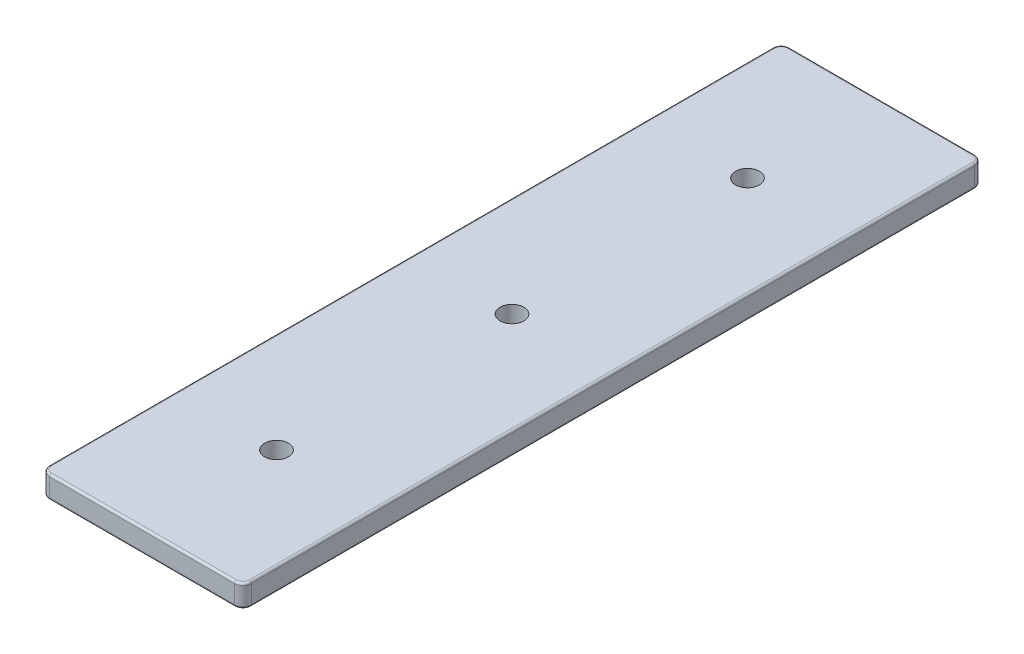
ISO-10303-21;
HEADER;
FILE_DESCRIPTION(('STEP AP214'),'2;1');
FILE_NAME('part.step','',(''),(''),'','','');
FILE_SCHEMA(('AUTOMOTIVE_DESIGN { 1 0 10303 214 1 1 1 1 }'));
ENDSEC;
DATA;
#1=APPLICATION_CONTEXT('core data for automotive mechanical design processes');
#2=APPLICATION_PROTOCOL_DEFINITION('international standard','automotive_design',2000,#1);
#3=PRODUCT_CONTEXT('',#1,'mechanical');
#4=PRODUCT('Part','Part','',(#3));
#5=PRODUCT_RELATED_PRODUCT_CATEGORY('part','',(#4));
#6=PRODUCT_DEFINITION_FORMATION('','',#4);
#7=PRODUCT_DEFINITION_CONTEXT('part definition',#1,'design');
#8=PRODUCT_DEFINITION('design','',#6,#7);
#9=PRODUCT_DEFINITION_SHAPE('','',#8);
#10=(LENGTH_UNIT() NAMED_UNIT(*) SI_UNIT(.MILLI.,.METRE.));
#11=(NAMED_UNIT(*) PLANE_ANGLE_UNIT() SI_UNIT($,.RADIAN.));
#12=(NAMED_UNIT(*) SI_UNIT($,.STERADIAN.) SOLID_ANGLE_UNIT());
#13=UNCERTAINTY_MEASURE_WITH_UNIT(LENGTH_MEASURE(1.E-05),#10,'distance_accuracy_value','');
#14=(GEOMETRIC_REPRESENTATION_CONTEXT(3) GLOBAL_UNCERTAINTY_ASSIGNED_CONTEXT((#13)) GLOBAL_UNIT_ASSIGNED_CONTEXT((#10,
#11,#12)) REPRESENTATION_CONTEXT('',''));
#15=CARTESIAN_POINT('',(0.,0.,0.));
#16=DIRECTION('',(0.,0.,1.));
#17=DIRECTION('',(1.,0.,0.));
#18=AXIS2_PLACEMENT_3D('',#15,#16,#17);
#19=CARTESIAN_POINT('',(19.05,-4.63020833333333,139.7));
#20=DIRECTION('',(-1.,0.,0.));
#21=DIRECTION('',(0.,0.,1.));
#22=AXIS2_PLACEMENT_3D('',#19,#20,#21);
#23=PLANE('',#22);
#24=DIRECTION('',(0.,1.,0.));
#25=VECTOR('',#24,1.);
#26=CARTESIAN_POINT('',(19.05,-4.63020833333333,1.58749999999999));
#27=LINE('',#26,#25);
#28=CARTESIAN_POINT('',(19.05,-4.23333333333333,1.58749999999999));
#29=VERTEX_POINT('',#28);
#30=CARTESIAN_POINT('',(19.05,-0.79375,1.58749999999999));
#31=VERTEX_POINT('',#30);
#32=EDGE_CURVE('E359',#29,#31,#27,.T.);
#33=ORIENTED_EDGE('',*,*,#32,.T.);
#34=DIRECTION('',(0.,0.,1.));
#35=VECTOR('',#34,1.);
#36=CARTESIAN_POINT('',(19.05,-0.79375,139.7));
#37=LINE('',#36,#35);
#38=CARTESIAN_POINT('',(19.05,-0.79375,138.1125));
#39=VERTEX_POINT('',#38);
#40=EDGE_CURVE('E11',#31,#39,#37,.T.);
#41=ORIENTED_EDGE('',*,*,#40,.T.);
#42=DIRECTION('',(0.,1.,0.));
#43=VECTOR('',#42,1.);
#44=CARTESIAN_POINT('',(19.05,-4.63020833333333,138.1125));
#45=LINE('',#44,#43);
#46=CARTESIAN_POINT('',(19.05,-4.23333333333333,138.1125));
#47=VERTEX_POINT('',#46);
#48=EDGE_CURVE('E363',#39,#47,#45,.F.);
#49=ORIENTED_EDGE('',*,*,#48,.T.);
#50=DIRECTION('',(0.,0.,1.));
#51=VECTOR('',#50,1.);
#52=CARTESIAN_POINT('',(19.05,-4.23333333333333,1.58749999999999));
#53=LINE('',#52,#51);
#54=EDGE_CURVE('E51',#47,#29,#53,.F.);
#55=ORIENTED_EDGE('',*,*,#54,.T.);
#56=EDGE_LOOP('',(#33,#41,#49,#55));
#57=FACE_BOUND('',#56,.T.);
#58=ADVANCED_FACE('F41',(#57),#23,.F.);
#59=CARTESIAN_POINT('',(-19.05,-4.63020833333333,139.7));
#60=DIRECTION('',(0.,0.,-1.));
#61=DIRECTION('',(-1.,0.,0.));
#62=AXIS2_PLACEMENT_3D('',#59,#60,#61);
#63=PLANE('',#62);
#64=DIRECTION('',(0.,1.,0.));
#65=VECTOR('',#64,1.);
#66=CARTESIAN_POINT('',(17.4625,-4.63020833333333,139.7));
#67=LINE('',#66,#65);
#68=CARTESIAN_POINT('',(17.4625,-4.23333333333333,139.7));
#69=VERTEX_POINT('',#68);
#70=CARTESIAN_POINT('',(17.4625,-0.79375,139.7));
#71=VERTEX_POINT('',#70);
#72=EDGE_CURVE('E355',#69,#71,#67,.T.);
#73=ORIENTED_EDGE('',*,*,#72,.T.);
#74=DIRECTION('',(-1.,0.,0.));
#75=VECTOR('',#74,1.);
#76=CARTESIAN_POINT('',(-19.05,-0.79375,139.7));
#77=LINE('',#76,#75);
#78=CARTESIAN_POINT('',(-17.4625,-0.79375,139.7));
#79=VERTEX_POINT('',#78);
#80=EDGE_CURVE('E244',#71,#79,#77,.T.);
#81=ORIENTED_EDGE('',*,*,#80,.T.);
#82=DIRECTION('',(0.,1.,0.));
#83=VECTOR('',#82,1.);
#84=CARTESIAN_POINT('',(-17.4625,-4.63020833333333,139.7));
#85=LINE('',#84,#83);
#86=CARTESIAN_POINT('',(-17.4625,-4.23333333333333,139.7));
#87=VERTEX_POINT('',#86);
#88=EDGE_CURVE('E299',#79,#87,#85,.F.);
#89=ORIENTED_EDGE('',*,*,#88,.T.);
#90=DIRECTION('',(-1.,0.,0.));
#91=VECTOR('',#90,1.);
#92=CARTESIAN_POINT('',(17.4625,-4.23333333333333,139.7));
#93=LINE('',#92,#91);
#94=EDGE_CURVE('E241',#87,#69,#93,.F.);
#95=ORIENTED_EDGE('',*,*,#94,.T.);
#96=EDGE_LOOP('',(#73,#81,#89,#95));
#97=FACE_BOUND('',#96,.T.);
#98=ADVANCED_FACE('F414',(#97),#63,.F.);
#99=CARTESIAN_POINT('',(-19.05,-4.63020833333333,139.7));
#100=DIRECTION('',(1.,0.,0.));
#101=DIRECTION('',(0.,0.,-1.));
#102=AXIS2_PLACEMENT_3D('',#99,#100,#101);
#103=PLANE('',#102);
#104=DIRECTION('',(0.,1.,0.));
#105=VECTOR('',#104,1.);
#106=CARTESIAN_POINT('',(-19.05,-4.63020833333333,138.1125));
#107=LINE('',#106,#105);
#108=CARTESIAN_POINT('',(-19.05,-4.23333333333333,138.1125));
#109=VERTEX_POINT('',#108);
#110=CARTESIAN_POINT('',(-19.05,-0.79375,138.1125));
#111=VERTEX_POINT('',#110);
#112=EDGE_CURVE('E371',#109,#111,#107,.T.);
#113=ORIENTED_EDGE('',*,*,#112,.T.);
#114=DIRECTION('',(0.,0.,-1.));
#115=VECTOR('',#114,1.);
#116=CARTESIAN_POINT('',(-19.05,-0.79375,139.7));
#117=LINE('',#116,#115);
#118=CARTESIAN_POINT('',(-19.05,-0.79375,1.58749999999999));
#119=VERTEX_POINT('',#118);
#120=EDGE_CURVE('E232',#111,#119,#117,.T.);
#121=ORIENTED_EDGE('',*,*,#120,.T.);
#122=DIRECTION('',(0.,1.,0.));
#123=VECTOR('',#122,1.);
#124=CARTESIAN_POINT('',(-19.05,-4.63020833333333,1.58749999999999));
#125=LINE('',#124,#123);
#126=CARTESIAN_POINT('',(-19.05,-4.23333333333333,1.58749999999999));
#127=VERTEX_POINT('',#126);
#128=EDGE_CURVE('E367',#119,#127,#125,.F.);
#129=ORIENTED_EDGE('',*,*,#128,.T.);
#130=DIRECTION('',(0.,0.,-1.));
#131=VECTOR('',#130,1.);
#132=CARTESIAN_POINT('',(-19.05,-4.23333333333333,138.1125));
#133=LINE('',#132,#131);
#134=EDGE_CURVE('E229',#127,#109,#133,.F.);
#135=ORIENTED_EDGE('',*,*,#134,.T.);
#136=EDGE_LOOP('',(#113,#121,#129,#135));
#137=FACE_BOUND('',#136,.T.);
#138=ADVANCED_FACE('F461',(#137),#103,.F.);
#139=CARTESIAN_POINT('',(-19.05,-4.63020833333333,0.));
#140=DIRECTION('',(0.,0.,1.));
#141=DIRECTION('',(1.,0.,0.));
#142=AXIS2_PLACEMENT_3D('',#139,#140,#141);
#143=PLANE('',#142);
#144=DIRECTION('',(0.,1.,0.));
#145=VECTOR('',#144,1.);
#146=CARTESIAN_POINT('',(-17.4625,-4.63020833333333,0.));
#147=LINE('',#146,#145);
#148=CARTESIAN_POINT('',(-17.4625,-4.23333333333333,0.));
#149=VERTEX_POINT('',#148);
#150=CARTESIAN_POINT('',(-17.4625,-0.79375,0.));
#151=VERTEX_POINT('',#150);
#152=EDGE_CURVE('E184',#149,#151,#147,.T.);
#153=ORIENTED_EDGE('',*,*,#152,.T.);
#154=DIRECTION('',(1.,0.,0.));
#155=VECTOR('',#154,1.);
#156=CARTESIAN_POINT('',(-19.05,-0.79375,0.));
#157=LINE('',#156,#155);
#158=CARTESIAN_POINT('',(17.4625,-0.79375,0.));
#159=VERTEX_POINT('',#158);
#160=EDGE_CURVE('E220',#151,#159,#157,.T.);
#161=ORIENTED_EDGE('',*,*,#160,.T.);
#162=DIRECTION('',(0.,1.,0.));
#163=VECTOR('',#162,1.);
#164=CARTESIAN_POINT('',(17.4625,-4.63020833333333,0.));
#165=LINE('',#164,#163);
#166=CARTESIAN_POINT('',(17.4625,-4.23333333333333,0.));
#167=VERTEX_POINT('',#166);
#168=EDGE_CURVE('E188',#159,#167,#165,.F.);
#169=ORIENTED_EDGE('',*,*,#168,.T.);
#170=DIRECTION('',(1.,0.,0.));
#171=VECTOR('',#170,1.);
#172=CARTESIAN_POINT('',(-17.4625,-4.23333333333333,0.));
#173=LINE('',#172,#171);
#174=EDGE_CURVE('E217',#167,#149,#173,.F.);
#175=ORIENTED_EDGE('',*,*,#174,.T.);
#176=EDGE_LOOP('',(#153,#161,#169,#175));
#177=FACE_BOUND('',#176,.T.);
#178=ADVANCED_FACE('F378',(#177),#143,.F.);
#179=CARTESIAN_POINT('',(0.,-4.63020833333333,0.));
#180=DIRECTION('',(0.,-1.,0.));
#181=DIRECTION('',(0.,0.,-1.));
#182=AXIS2_PLACEMENT_3D('',#179,#180,#181);
#183=PLANE('',#182);
#184=CARTESIAN_POINT('',(0.,-4.63020833333333,114.3));
#185=DIRECTION('',(0.,1.,0.));
#186=DIRECTION('',(0.,0.,1.));
#187=AXIS2_PLACEMENT_3D('',#184,#185,#186);
#188=CIRCLE('',#187,2.2479);
#189=CARTESIAN_POINT('',(0.,-4.63020833333333,116.5479));
#190=VERTEX_POINT('',#189);
#191=EDGE_CURVE('E346',#190,#190,#188,.T.);
#192=ORIENTED_EDGE('',*,*,#191,.T.);
#193=EDGE_LOOP('',(#192));
#194=FACE_BOUND('',#193,.T.);
#195=CARTESIAN_POINT('',(0.,-4.63020833333333,25.4));
#196=DIRECTION('',(0.,1.,0.));
#197=DIRECTION('',(0.,0.,1.));
#198=AXIS2_PLACEMENT_3D('',#195,#196,#197);
#199=CIRCLE('',#198,2.2479);
#200=CARTESIAN_POINT('',(0.,-4.63020833333333,27.6479));
#201=VERTEX_POINT('',#200);
#202=EDGE_CURVE('E333',#201,#201,#199,.T.);
#203=ORIENTED_EDGE('',*,*,#202,.T.);
#204=EDGE_LOOP('',(#203));
#205=FACE_BOUND('',#204,.T.);
#206=CARTESIAN_POINT('',(0.,-4.63020833333333,69.85));
#207=DIRECTION('',(0.,1.,0.));
#208=DIRECTION('',(0.,0.,1.));
#209=AXIS2_PLACEMENT_3D('',#206,#207,#208);
#210=CIRCLE('',#209,2.2479);
#211=CARTESIAN_POINT('',(0.,-4.63020833333333,72.0979));
#212=VERTEX_POINT('',#211);
#213=EDGE_CURVE('E332',#212,#212,#210,.T.);
#214=ORIENTED_EDGE('',*,*,#213,.T.);
#215=EDGE_LOOP('',(#214));
#216=FACE_BOUND('',#215,.T.);
#217=DIRECTION('',(1.,0.,0.));
#218=VECTOR('',#217,1.);
#219=CARTESIAN_POINT('',(17.4625,-4.63020833333333,0.396875000000005));
#220=LINE('',#219,#218);
#221=CARTESIAN_POINT('',(-17.4625,-4.63020833333333,0.396875000000001));
#222=VERTEX_POINT('',#221);
#223=CARTESIAN_POINT('',(17.4625,-4.63020833333333,0.396875000000005));
#224=VERTEX_POINT('',#223);
#225=EDGE_CURVE('E59',#222,#224,#220,.T.);
#226=ORIENTED_EDGE('',*,*,#225,.T.);
#227=CARTESIAN_POINT('',(17.4625,-4.63020833333333,1.58749999999999));
#228=DIRECTION('',(0.,-1.,0.));
#229=DIRECTION('',(0.,0.,-1.));
#230=AXIS2_PLACEMENT_3D('',#227,#228,#229);
#231=CIRCLE('',#230,1.190625);
#232=CARTESIAN_POINT('',(18.653125,-4.63020833333333,1.58749999999999));
#233=VERTEX_POINT('',#232);
#234=EDGE_CURVE('E271',#224,#233,#231,.T.);
#235=ORIENTED_EDGE('',*,*,#234,.T.);
#236=DIRECTION('',(0.,0.,1.));
#237=VECTOR('',#236,1.);
#238=CARTESIAN_POINT('',(18.653125,-4.63020833333333,138.1125));
#239=LINE('',#238,#237);
#240=CARTESIAN_POINT('',(18.653125,-4.63020833333333,138.1125));
#241=VERTEX_POINT('',#240);
#242=EDGE_CURVE('E252',#233,#241,#239,.T.);
#243=ORIENTED_EDGE('',*,*,#242,.T.);
#244=CARTESIAN_POINT('',(17.4625,-4.63020833333333,138.1125));
#245=DIRECTION('',(0.,-1.,0.));
#246=DIRECTION('',(0.,0.,-1.));
#247=AXIS2_PLACEMENT_3D('',#244,#245,#246);
#248=CIRCLE('',#247,1.190625);
#249=CARTESIAN_POINT('',(17.4625,-4.63020833333333,139.303125));
#250=VERTEX_POINT('',#249);
#251=EDGE_CURVE('E255',#241,#250,#248,.T.);
#252=ORIENTED_EDGE('',*,*,#251,.T.);
#253=DIRECTION('',(-1.,0.,0.));
#254=VECTOR('',#253,1.);
#255=CARTESIAN_POINT('',(-17.4625,-4.63020833333333,139.303125));
#256=LINE('',#255,#254);
#257=CARTESIAN_POINT('',(-17.4625,-4.63020833333333,139.303125));
#258=VERTEX_POINT('',#257);
#259=EDGE_CURVE('E258',#250,#258,#256,.T.);
#260=ORIENTED_EDGE('',*,*,#259,.T.);
#261=CARTESIAN_POINT('',(-17.4625,-4.63020833333333,138.1125));
#262=DIRECTION('',(0.,-1.,0.));
#263=DIRECTION('',(0.,0.,-1.));
#264=AXIS2_PLACEMENT_3D('',#261,#262,#263);
#265=CIRCLE('',#264,1.190625);
#266=CARTESIAN_POINT('',(-18.653125,-4.63020833333333,138.1125));
#267=VERTEX_POINT('',#266);
#268=EDGE_CURVE('E261',#258,#267,#265,.T.);
#269=ORIENTED_EDGE('',*,*,#268,.T.);
#270=DIRECTION('',(0.,0.,-1.));
#271=VECTOR('',#270,1.);
#272=CARTESIAN_POINT('',(-18.653125,-4.63020833333333,1.58749999999999));
#273=LINE('',#272,#271);
#274=CARTESIAN_POINT('',(-18.653125,-4.63020833333333,1.58749999999999));
#275=VERTEX_POINT('',#274);
#276=EDGE_CURVE('E264',#267,#275,#273,.T.);
#277=ORIENTED_EDGE('',*,*,#276,.T.);
#278=CARTESIAN_POINT('',(-17.4625,-4.63020833333333,1.5875));
#279=DIRECTION('',(0.,-1.,0.));
#280=DIRECTION('',(0.,0.,-1.));
#281=AXIS2_PLACEMENT_3D('',#278,#279,#280);
#282=CIRCLE('',#281,1.190625);
#283=EDGE_CURVE('E64',#275,#222,#282,.T.);
#284=ORIENTED_EDGE('',*,*,#283,.T.);
#285=EDGE_LOOP('',(#226,#235,#243,#252,#260,#269,#277,#284));
#286=FACE_BOUND('',#285,.T.);
#287=ADVANCED_FACE('F430',(#194,#205,#216,#286),#183,.T.);
#288=CARTESIAN_POINT('',(0.,-0.396875,0.));
#289=DIRECTION('',(0.,-1.,0.));
#290=DIRECTION('',(0.,0.,-1.));
#291=AXIS2_PLACEMENT_3D('',#288,#289,#290);
#292=PLANE('',#291);
#293=CARTESIAN_POINT('',(0.,-0.396875,114.3));
#294=DIRECTION('',(0.,-1.,0.));
#295=DIRECTION('',(0.,0.,-1.));
#296=AXIS2_PLACEMENT_3D('',#293,#294,#295);
#297=CIRCLE('',#296,2.2479);
#298=CARTESIAN_POINT('',(0.,-0.396875,112.0521));
#299=VERTEX_POINT('',#298);
#300=EDGE_CURVE('E45',#299,#299,#297,.T.);
#301=ORIENTED_EDGE('',*,*,#300,.T.);
#302=EDGE_LOOP('',(#301));
#303=FACE_BOUND('',#302,.T.);
#304=CARTESIAN_POINT('',(0.,-0.396875,25.4));
#305=DIRECTION('',(0.,-1.,0.));
#306=DIRECTION('',(0.,0.,-1.));
#307=AXIS2_PLACEMENT_3D('',#304,#305,#306);
#308=CIRCLE('',#307,2.2479);
#309=CARTESIAN_POINT('',(0.,-0.396875,23.1521));
#310=VERTEX_POINT('',#309);
#311=EDGE_CURVE('E329',#310,#310,#308,.T.);
#312=ORIENTED_EDGE('',*,*,#311,.T.);
#313=EDGE_LOOP('',(#312));
#314=FACE_BOUND('',#313,.T.);
#315=CARTESIAN_POINT('',(0.,-0.396875,69.85));
#316=DIRECTION('',(0.,-1.,0.));
#317=DIRECTION('',(0.,0.,-1.));
#318=AXIS2_PLACEMENT_3D('',#315,#316,#317);
#319=CIRCLE('',#318,2.2479);
#320=CARTESIAN_POINT('',(0.,-0.396875,67.6021));
#321=VERTEX_POINT('',#320);
#322=EDGE_CURVE('E304',#321,#321,#319,.T.);
#323=ORIENTED_EDGE('',*,*,#322,.T.);
#324=EDGE_LOOP('',(#323));
#325=FACE_BOUND('',#324,.T.);
#326=DIRECTION('',(0.,0.,1.));
#327=VECTOR('',#326,1.);
#328=CARTESIAN_POINT('',(18.653125,-0.396875,0.));
#329=LINE('',#328,#327);
#330=CARTESIAN_POINT('',(18.653125,-0.396875,138.1125));
#331=VERTEX_POINT('',#330);
#332=CARTESIAN_POINT('',(18.653125,-0.396875,1.58749999999999));
#333=VERTEX_POINT('',#332);
#334=EDGE_CURVE('E160',#331,#333,#329,.F.);
#335=ORIENTED_EDGE('',*,*,#334,.T.);
#336=CARTESIAN_POINT('',(17.4625,-0.396875,1.58749999999999));
#337=DIRECTION('',(0.,-1.,0.));
#338=DIRECTION('',(0.,0.,-1.));
#339=AXIS2_PLACEMENT_3D('',#336,#337,#338);
#340=CIRCLE('',#339,1.190625);
#341=CARTESIAN_POINT('',(17.4625,-0.396875,0.396875000000005));
#342=VERTEX_POINT('',#341);
#343=EDGE_CURVE('E206',#333,#342,#340,.F.);
#344=ORIENTED_EDGE('',*,*,#343,.T.);
#345=DIRECTION('',(1.,0.,0.));
#346=VECTOR('',#345,1.);
#347=CARTESIAN_POINT('',(0.,-0.396875,0.396875000000003));
#348=LINE('',#347,#346);
#349=CARTESIAN_POINT('',(-17.4625,-0.396875,0.396875000000001));
#350=VERTEX_POINT('',#349);
#351=EDGE_CURVE('E203',#342,#350,#348,.F.);
#352=ORIENTED_EDGE('',*,*,#351,.T.);
#353=CARTESIAN_POINT('',(-17.4625,-0.396875,1.5875));
#354=DIRECTION('',(0.,-1.,0.));
#355=DIRECTION('',(0.,0.,-1.));
#356=AXIS2_PLACEMENT_3D('',#353,#354,#355);
#357=CIRCLE('',#356,1.190625);
#358=CARTESIAN_POINT('',(-18.653125,-0.396875,1.58749999999999));
#359=VERTEX_POINT('',#358);
#360=EDGE_CURVE('E200',#350,#359,#357,.F.);
#361=ORIENTED_EDGE('',*,*,#360,.T.);
#362=DIRECTION('',(0.,0.,-1.));
#363=VECTOR('',#362,1.);
#364=CARTESIAN_POINT('',(-18.653125,-0.396875,0.));
#365=LINE('',#364,#363);
#366=CARTESIAN_POINT('',(-18.653125,-0.396875,138.1125));
#367=VERTEX_POINT('',#366);
#368=EDGE_CURVE('E197',#359,#367,#365,.F.);
#369=ORIENTED_EDGE('',*,*,#368,.T.);
#370=CARTESIAN_POINT('',(-17.4625,-0.396875,138.1125));
#371=DIRECTION('',(0.,-1.,0.));
#372=DIRECTION('',(0.,0.,-1.));
#373=AXIS2_PLACEMENT_3D('',#370,#371,#372);
#374=CIRCLE('',#373,1.190625);
#375=CARTESIAN_POINT('',(-17.4625,-0.396875,139.303125));
#376=VERTEX_POINT('',#375);
#377=EDGE_CURVE('E194',#367,#376,#374,.F.);
#378=ORIENTED_EDGE('',*,*,#377,.T.);
#379=DIRECTION('',(-1.,0.,0.));
#380=VECTOR('',#379,1.);
#381=CARTESIAN_POINT('',(0.,-0.396875,139.303125));
#382=LINE('',#381,#380);
#383=CARTESIAN_POINT('',(17.4625,-0.396875,139.303125));
#384=VERTEX_POINT('',#383);
#385=EDGE_CURVE('E163',#376,#384,#382,.F.);
#386=ORIENTED_EDGE('',*,*,#385,.T.);
#387=CARTESIAN_POINT('',(17.4625,-0.396875,138.1125));
#388=DIRECTION('',(0.,-1.,0.));
#389=DIRECTION('',(0.,0.,-1.));
#390=AXIS2_PLACEMENT_3D('',#387,#388,#389);
#391=CIRCLE('',#390,1.190625);
#392=EDGE_CURVE('E155',#384,#331,#391,.F.);
#393=ORIENTED_EDGE('',*,*,#392,.T.);
#394=EDGE_LOOP('',(#335,#344,#352,#361,#369,#378,#386,#393));
#395=FACE_BOUND('',#394,.T.);
#396=ADVANCED_FACE('F157',(#303,#314,#325,#395),#292,.F.);
#397=CARTESIAN_POINT('',(17.4625,-4.63020833333333,138.1125));
#398=DIRECTION('',(0.,1.,0.));
#399=DIRECTION('',(0.,0.,1.));
#400=AXIS2_PLACEMENT_3D('',#397,#398,#399);
#401=CYLINDRICAL_SURFACE('',#400,1.5875);
#402=ORIENTED_EDGE('',*,*,#48,.F.);
#403=CARTESIAN_POINT('',(17.4625,-0.79375,138.1125));
#404=DIRECTION('',(0.,-1.,0.));
#405=DIRECTION('',(0.,0.,-1.));
#406=AXIS2_PLACEMENT_3D('',#403,#404,#405);
#407=CIRCLE('',#406,1.5875);
#408=EDGE_CURVE('E173',#39,#71,#407,.T.);
#409=ORIENTED_EDGE('',*,*,#408,.T.);
#410=ORIENTED_EDGE('',*,*,#72,.F.);
#411=CARTESIAN_POINT('',(17.4625,-4.23333333333333,138.1125));
#412=DIRECTION('',(0.,-1.,0.));
#413=DIRECTION('',(0.,0.,-1.));
#414=AXIS2_PLACEMENT_3D('',#411,#412,#413);
#415=CIRCLE('',#414,1.5875);
#416=EDGE_CURVE('E247',#69,#47,#415,.F.);
#417=ORIENTED_EDGE('',*,*,#416,.T.);
#418=EDGE_LOOP('',(#402,#409,#410,#417));
#419=FACE_BOUND('',#418,.T.);
#420=ADVANCED_FACE('F438',(#419),#401,.T.);
#421=CARTESIAN_POINT('',(-17.4625,-4.63020833333333,138.1125));
#422=DIRECTION('',(0.,1.,0.));
#423=DIRECTION('',(0.,0.,1.));
#424=AXIS2_PLACEMENT_3D('',#421,#422,#423);
#425=CYLINDRICAL_SURFACE('',#424,1.5875);
#426=ORIENTED_EDGE('',*,*,#88,.F.);
#427=CARTESIAN_POINT('',(-17.4625,-0.79375,138.1125));
#428=DIRECTION('',(0.,-1.,0.));
#429=DIRECTION('',(0.,0.,-1.));
#430=AXIS2_PLACEMENT_3D('',#427,#428,#429);
#431=CIRCLE('',#430,1.5875);
#432=EDGE_CURVE('E238',#79,#111,#431,.T.);
#433=ORIENTED_EDGE('',*,*,#432,.T.);
#434=ORIENTED_EDGE('',*,*,#112,.F.);
#435=CARTESIAN_POINT('',(-17.4625,-4.23333333333333,138.1125));
#436=DIRECTION('',(0.,-1.,0.));
#437=DIRECTION('',(0.,0.,-1.));
#438=AXIS2_PLACEMENT_3D('',#435,#436,#437);
#439=CIRCLE('',#438,1.5875);
#440=EDGE_CURVE('E235',#109,#87,#439,.F.);
#441=ORIENTED_EDGE('',*,*,#440,.T.);
#442=EDGE_LOOP('',(#426,#433,#434,#441));
#443=FACE_BOUND('',#442,.T.);
#444=ADVANCED_FACE('F418',(#443),#425,.T.);
#445=CARTESIAN_POINT('',(-17.4625,-4.63020833333333,1.5875));
#446=DIRECTION('',(0.,1.,0.));
#447=DIRECTION('',(0.,0.,1.));
#448=AXIS2_PLACEMENT_3D('',#445,#446,#447);
#449=CYLINDRICAL_SURFACE('',#448,1.5875);
#450=ORIENTED_EDGE('',*,*,#128,.F.);
#451=CARTESIAN_POINT('',(-17.4625,-0.79375,1.5875));
#452=DIRECTION('',(0.,-1.,0.));
#453=DIRECTION('',(0.,0.,-1.));
#454=AXIS2_PLACEMENT_3D('',#451,#452,#453);
#455=CIRCLE('',#454,1.5875);
#456=EDGE_CURVE('E226',#119,#151,#455,.T.);
#457=ORIENTED_EDGE('',*,*,#456,.T.);
#458=ORIENTED_EDGE('',*,*,#152,.F.);
#459=CARTESIAN_POINT('',(-17.4625,-4.23333333333333,1.5875));
#460=DIRECTION('',(0.,-1.,0.));
#461=DIRECTION('',(0.,0.,-1.));
#462=AXIS2_PLACEMENT_3D('',#459,#460,#461);
#463=CIRCLE('',#462,1.5875);
#464=EDGE_CURVE('E223',#149,#127,#463,.F.);
#465=ORIENTED_EDGE('',*,*,#464,.T.);
#466=EDGE_LOOP('',(#450,#457,#458,#465));
#467=FACE_BOUND('',#466,.T.);
#468=ADVANCED_FACE('F459',(#467),#449,.T.);
#469=CARTESIAN_POINT('',(17.4625,-4.63020833333333,1.58749999999999));
#470=DIRECTION('',(0.,1.,0.));
#471=DIRECTION('',(0.,0.,1.));
#472=AXIS2_PLACEMENT_3D('',#469,#470,#471);
#473=CYLINDRICAL_SURFACE('',#472,1.5875);
#474=ORIENTED_EDGE('',*,*,#168,.F.);
#475=CARTESIAN_POINT('',(17.4625,-0.79375,1.58749999999999));
#476=DIRECTION('',(0.,-1.,0.));
#477=DIRECTION('',(0.,0.,-1.));
#478=AXIS2_PLACEMENT_3D('',#475,#476,#477);
#479=CIRCLE('',#478,1.5875);
#480=EDGE_CURVE('E213',#159,#31,#479,.T.);
#481=ORIENTED_EDGE('',*,*,#480,.T.);
#482=ORIENTED_EDGE('',*,*,#32,.F.);
#483=CARTESIAN_POINT('',(17.4625,-4.23333333333333,1.58749999999999));
#484=DIRECTION('',(0.,-1.,0.));
#485=DIRECTION('',(0.,0.,-1.));
#486=AXIS2_PLACEMENT_3D('',#483,#484,#485);
#487=CIRCLE('',#486,1.5875);
#488=EDGE_CURVE('E209',#29,#167,#487,.F.);
#489=ORIENTED_EDGE('',*,*,#488,.T.);
#490=EDGE_LOOP('',(#474,#481,#482,#489));
#491=FACE_BOUND('',#490,.T.);
#492=ADVANCED_FACE('F384',(#491),#473,.T.);
#493=CARTESIAN_POINT('',(-17.4625,-0.79375,138.1125));
#494=DIRECTION('',(0.,-1.,0.));
#495=DIRECTION('',(0.,0.,-1.));
#496=AXIS2_PLACEMENT_3D('',#493,#494,#495);
#497=TOROIDAL_SURFACE('',#496,1.190625,0.396875);
#498=CARTESIAN_POINT('',(-18.653125,-0.79375,138.1125));
#499=DIRECTION('',(0.,0.,-1.));
#500=DIRECTION('',(-1.,0.,0.));
#501=AXIS2_PLACEMENT_3D('',#498,#499,#500);
#502=CIRCLE('',#501,0.396875);
#503=EDGE_CURVE('E291',#111,#367,#502,.T.);
#504=ORIENTED_EDGE('',*,*,#503,.F.);
#505=ORIENTED_EDGE('',*,*,#432,.F.);
#506=CARTESIAN_POINT('',(-17.4625,-0.79375,139.303125));
#507=DIRECTION('',(1.,0.,0.));
#508=DIRECTION('',(0.,0.,-1.));
#509=AXIS2_PLACEMENT_3D('',#506,#507,#508);
#510=CIRCLE('',#509,0.396875);
#511=EDGE_CURVE('E295',#376,#79,#510,.T.);
#512=ORIENTED_EDGE('',*,*,#511,.F.);
#513=ORIENTED_EDGE('',*,*,#377,.F.);
#514=EDGE_LOOP('',(#504,#505,#512,#513));
#515=FACE_BOUND('',#514,.T.);
#516=ADVANCED_FACE('F407',(#515),#497,.T.);
#517=CARTESIAN_POINT('',(-19.05,-0.79375,139.303125));
#518=DIRECTION('',(-1.,0.,0.));
#519=DIRECTION('',(0.,0.,1.));
#520=AXIS2_PLACEMENT_3D('',#517,#518,#519);
#521=CYLINDRICAL_SURFACE('',#520,0.396875);
#522=ORIENTED_EDGE('',*,*,#511,.T.);
#523=ORIENTED_EDGE('',*,*,#80,.F.);
#524=CARTESIAN_POINT('',(17.4625,-0.79375,139.303125));
#525=DIRECTION('',(1.,0.,0.));
#526=DIRECTION('',(0.,0.,-1.));
#527=AXIS2_PLACEMENT_3D('',#524,#525,#526);
#528=CIRCLE('',#527,0.396875);
#529=EDGE_CURVE('E288',#384,#71,#528,.T.);
#530=ORIENTED_EDGE('',*,*,#529,.F.);
#531=ORIENTED_EDGE('',*,*,#385,.F.);
#532=EDGE_LOOP('',(#522,#523,#530,#531));
#533=FACE_BOUND('',#532,.T.);
#534=ADVANCED_FACE('F411',(#533),#521,.T.);
#535=CARTESIAN_POINT('',(-18.653125,-0.79375,139.7));
#536=DIRECTION('',(0.,0.,-1.));
#537=DIRECTION('',(-1.,0.,0.));
#538=AXIS2_PLACEMENT_3D('',#535,#536,#537);
#539=CYLINDRICAL_SURFACE('',#538,0.396875);
#540=ORIENTED_EDGE('',*,*,#503,.T.);
#541=ORIENTED_EDGE('',*,*,#368,.F.);
#542=CARTESIAN_POINT('',(-18.653125,-0.79375,1.58749999999999));
#543=DIRECTION('',(0.,0.,-1.));
#544=DIRECTION('',(0.,1.,0.));
#545=AXIS2_PLACEMENT_3D('',#542,#543,#544);
#546=CIRCLE('',#545,0.396875);
#547=EDGE_CURVE('E177',#119,#359,#546,.T.);
#548=ORIENTED_EDGE('',*,*,#547,.F.);
#549=ORIENTED_EDGE('',*,*,#120,.F.);
#550=EDGE_LOOP('',(#540,#541,#548,#549));
#551=FACE_BOUND('',#550,.T.);
#552=ADVANCED_FACE('F402',(#551),#539,.T.);
#553=CARTESIAN_POINT('',(17.4625,-0.79375,138.1125));
#554=DIRECTION('',(0.,-1.,0.));
#555=DIRECTION('',(0.,0.,-1.));
#556=AXIS2_PLACEMENT_3D('',#553,#554,#555);
#557=TOROIDAL_SURFACE('',#556,1.190625,0.396875);
#558=ORIENTED_EDGE('',*,*,#529,.T.);
#559=ORIENTED_EDGE('',*,*,#408,.F.);
#560=CARTESIAN_POINT('',(18.653125,-0.79375,138.1125));
#561=DIRECTION('',(0.,0.,-1.));
#562=DIRECTION('',(-1.,0.,0.));
#563=AXIS2_PLACEMENT_3D('',#560,#561,#562);
#564=CIRCLE('',#563,0.396875);
#565=EDGE_CURVE('E171',#331,#39,#564,.T.);
#566=ORIENTED_EDGE('',*,*,#565,.F.);
#567=ORIENTED_EDGE('',*,*,#392,.F.);
#568=EDGE_LOOP('',(#558,#559,#566,#567));
#569=FACE_BOUND('',#568,.T.);
#570=ADVANCED_FACE('F172',(#569),#557,.T.);
#571=CARTESIAN_POINT('',(-17.4625,-0.79375,1.5875));
#572=DIRECTION('',(0.,-1.,0.));
#573=DIRECTION('',(0.,0.,-1.));
#574=AXIS2_PLACEMENT_3D('',#571,#572,#573);
#575=TOROIDAL_SURFACE('',#574,1.190625,0.396875);
#576=ORIENTED_EDGE('',*,*,#547,.T.);
#577=ORIENTED_EDGE('',*,*,#360,.F.);
#578=CARTESIAN_POINT('',(-17.4625,-0.79375,0.396875000000001));
#579=DIRECTION('',(1.,0.,0.));
#580=DIRECTION('',(0.,0.,-1.));
#581=AXIS2_PLACEMENT_3D('',#578,#579,#580);
#582=CIRCLE('',#581,0.396875);
#583=EDGE_CURVE('E178',#151,#350,#582,.T.);
#584=ORIENTED_EDGE('',*,*,#583,.F.);
#585=ORIENTED_EDGE('',*,*,#456,.F.);
#586=EDGE_LOOP('',(#576,#577,#584,#585));
#587=FACE_BOUND('',#586,.T.);
#588=ADVANCED_FACE('F397',(#587),#575,.T.);
#589=CARTESIAN_POINT('',(18.653125,-0.79375,139.7));
#590=DIRECTION('',(0.,0.,1.));
#591=DIRECTION('',(1.,0.,0.));
#592=AXIS2_PLACEMENT_3D('',#589,#590,#591);
#593=CYLINDRICAL_SURFACE('',#592,0.396875);
#594=ORIENTED_EDGE('',*,*,#565,.T.);
#595=ORIENTED_EDGE('',*,*,#40,.F.);
#596=CARTESIAN_POINT('',(18.653125,-0.79375,1.58749999999999));
#597=DIRECTION('',(0.,0.,-1.));
#598=DIRECTION('',(-1.,0.,0.));
#599=AXIS2_PLACEMENT_3D('',#596,#597,#598);
#600=CIRCLE('',#599,0.396875);
#601=EDGE_CURVE('E181',#333,#31,#600,.T.);
#602=ORIENTED_EDGE('',*,*,#601,.F.);
#603=ORIENTED_EDGE('',*,*,#334,.F.);
#604=EDGE_LOOP('',(#594,#595,#602,#603));
#605=FACE_BOUND('',#604,.T.);
#606=ADVANCED_FACE('F180',(#605),#593,.T.);
#607=CARTESIAN_POINT('',(-19.05,-0.79375,0.396875));
#608=DIRECTION('',(1.,0.,0.));
#609=DIRECTION('',(0.,0.,-1.));
#610=AXIS2_PLACEMENT_3D('',#607,#608,#609);
#611=CYLINDRICAL_SURFACE('',#610,0.396875);
#612=ORIENTED_EDGE('',*,*,#583,.T.);
#613=ORIENTED_EDGE('',*,*,#351,.F.);
#614=CARTESIAN_POINT('',(17.4625,-0.79375,0.396875000000005));
#615=DIRECTION('',(1.,0.,0.));
#616=DIRECTION('',(0.,0.,-1.));
#617=AXIS2_PLACEMENT_3D('',#614,#615,#616);
#618=CIRCLE('',#617,0.396875);
#619=EDGE_CURVE('E276',#159,#342,#618,.T.);
#620=ORIENTED_EDGE('',*,*,#619,.F.);
#621=ORIENTED_EDGE('',*,*,#160,.F.);
#622=EDGE_LOOP('',(#612,#613,#620,#621));
#623=FACE_BOUND('',#622,.T.);
#624=ADVANCED_FACE('F392',(#623),#611,.T.);
#625=CARTESIAN_POINT('',(17.4625,-0.79375,1.58749999999999));
#626=DIRECTION('',(0.,-1.,0.));
#627=DIRECTION('',(0.,0.,-1.));
#628=AXIS2_PLACEMENT_3D('',#625,#626,#627);
#629=TOROIDAL_SURFACE('',#628,1.190625,0.396875);
#630=ORIENTED_EDGE('',*,*,#601,.T.);
#631=ORIENTED_EDGE('',*,*,#480,.F.);
#632=ORIENTED_EDGE('',*,*,#619,.T.);
#633=ORIENTED_EDGE('',*,*,#343,.F.);
#634=EDGE_LOOP('',(#630,#631,#632,#633));
#635=FACE_BOUND('',#634,.T.);
#636=ADVANCED_FACE('F389',(#635),#629,.T.);
#637=CARTESIAN_POINT('',(-17.4625,-4.23333333333333,138.1125));
#638=DIRECTION('',(0.,-1.,0.));
#639=DIRECTION('',(0.,0.,-1.));
#640=AXIS2_PLACEMENT_3D('',#637,#638,#639);
#641=TOROIDAL_SURFACE('',#640,1.190625,0.396875);
#642=CARTESIAN_POINT('',(-17.4625,-4.23333333333333,139.303125));
#643=DIRECTION('',(1.,0.,0.));
#644=DIRECTION('',(0.,0.,-1.));
#645=AXIS2_PLACEMENT_3D('',#642,#643,#644);
#646=CIRCLE('',#645,0.396875);
#647=EDGE_CURVE('E323',#87,#258,#646,.T.);
#648=ORIENTED_EDGE('',*,*,#647,.F.);
#649=ORIENTED_EDGE('',*,*,#440,.F.);
#650=CARTESIAN_POINT('',(-18.653125,-4.23333333333333,138.1125));
#651=DIRECTION('',(0.,0.,-1.));
#652=DIRECTION('',(-1.,0.,0.));
#653=AXIS2_PLACEMENT_3D('',#650,#651,#652);
#654=CIRCLE('',#653,0.396875);
#655=EDGE_CURVE('E279',#267,#109,#654,.T.);
#656=ORIENTED_EDGE('',*,*,#655,.F.);
#657=ORIENTED_EDGE('',*,*,#268,.F.);
#658=EDGE_LOOP('',(#648,#649,#656,#657));
#659=FACE_BOUND('',#658,.T.);
#660=ADVANCED_FACE('F43',(#659),#641,.T.);
#661=CARTESIAN_POINT('',(-18.653125,-4.23333333333333,0.));
#662=DIRECTION('',(0.,0.,1.));
#663=DIRECTION('',(1.,0.,0.));
#664=AXIS2_PLACEMENT_3D('',#661,#662,#663);
#665=CYLINDRICAL_SURFACE('',#664,0.396875);
#666=ORIENTED_EDGE('',*,*,#655,.T.);
#667=ORIENTED_EDGE('',*,*,#134,.F.);
#668=CARTESIAN_POINT('',(-18.653125,-4.23333333333333,1.58749999999999));
#669=DIRECTION('',(0.,0.,-1.));
#670=DIRECTION('',(-1.,0.,0.));
#671=AXIS2_PLACEMENT_3D('',#668,#669,#670);
#672=CIRCLE('',#671,0.396875);
#673=EDGE_CURVE('E319',#275,#127,#672,.T.);
#674=ORIENTED_EDGE('',*,*,#673,.F.);
#675=ORIENTED_EDGE('',*,*,#276,.F.);
#676=EDGE_LOOP('',(#666,#667,#674,#675));
#677=FACE_BOUND('',#676,.T.);
#678=ADVANCED_FACE('F428',(#677),#665,.T.);
#679=CARTESIAN_POINT('',(0.,-4.23333333333333,139.303125));
#680=DIRECTION('',(1.,0.,0.));
#681=DIRECTION('',(0.,0.,-1.));
#682=AXIS2_PLACEMENT_3D('',#679,#680,#681);
#683=CYLINDRICAL_SURFACE('',#682,0.396875);
#684=ORIENTED_EDGE('',*,*,#647,.T.);
#685=ORIENTED_EDGE('',*,*,#259,.F.);
#686=CARTESIAN_POINT('',(17.4625,-4.23333333333333,139.303125));
#687=DIRECTION('',(1.,0.,0.));
#688=DIRECTION('',(0.,0.,-1.));
#689=AXIS2_PLACEMENT_3D('',#686,#687,#688);
#690=CIRCLE('',#689,0.396875);
#691=EDGE_CURVE('E315',#69,#250,#690,.T.);
#692=ORIENTED_EDGE('',*,*,#691,.F.);
#693=ORIENTED_EDGE('',*,*,#94,.F.);
#694=EDGE_LOOP('',(#684,#685,#692,#693));
#695=FACE_BOUND('',#694,.T.);
#696=ADVANCED_FACE('F433',(#695),#683,.T.);
#697=CARTESIAN_POINT('',(-17.4625,-4.23333333333333,1.5875));
#698=DIRECTION('',(0.,-1.,0.));
#699=DIRECTION('',(0.,0.,-1.));
#700=AXIS2_PLACEMENT_3D('',#697,#698,#699);
#701=TOROIDAL_SURFACE('',#700,1.190625,0.396875);
#702=ORIENTED_EDGE('',*,*,#673,.T.);
#703=ORIENTED_EDGE('',*,*,#464,.F.);
#704=CARTESIAN_POINT('',(-17.4625,-4.23333333333333,0.396875000000001));
#705=DIRECTION('',(1.,0.,0.));
#706=DIRECTION('',(0.,0.,-1.));
#707=AXIS2_PLACEMENT_3D('',#704,#705,#706);
#708=CIRCLE('',#707,0.396875);
#709=EDGE_CURVE('E311',#222,#149,#708,.T.);
#710=ORIENTED_EDGE('',*,*,#709,.F.);
#711=ORIENTED_EDGE('',*,*,#283,.F.);
#712=EDGE_LOOP('',(#702,#703,#710,#711));
#713=FACE_BOUND('',#712,.T.);
#714=ADVANCED_FACE('F456',(#713),#701,.T.);
#715=CARTESIAN_POINT('',(17.4625,-4.23333333333333,138.1125));
#716=DIRECTION('',(0.,-1.,0.));
#717=DIRECTION('',(0.,0.,-1.));
#718=AXIS2_PLACEMENT_3D('',#715,#716,#717);
#719=TOROIDAL_SURFACE('',#718,1.190625,0.396875);
#720=ORIENTED_EDGE('',*,*,#691,.T.);
#721=ORIENTED_EDGE('',*,*,#251,.F.);
#722=CARTESIAN_POINT('',(18.653125,-4.23333333333333,138.1125));
#723=DIRECTION('',(0.,0.,-1.));
#724=DIRECTION('',(-1.,0.,0.));
#725=AXIS2_PLACEMENT_3D('',#722,#723,#724);
#726=CIRCLE('',#725,0.396875);
#727=EDGE_CURVE('E307',#47,#241,#726,.T.);
#728=ORIENTED_EDGE('',*,*,#727,.F.);
#729=ORIENTED_EDGE('',*,*,#416,.F.);
#730=EDGE_LOOP('',(#720,#721,#728,#729));
#731=FACE_BOUND('',#730,.T.);
#732=ADVANCED_FACE('F444',(#731),#719,.T.);
#733=CARTESIAN_POINT('',(0.,-4.23333333333333,0.396875000000003));
#734=DIRECTION('',(-1.,0.,0.));
#735=DIRECTION('',(0.,0.,1.));
#736=AXIS2_PLACEMENT_3D('',#733,#734,#735);
#737=CYLINDRICAL_SURFACE('',#736,0.396875);
#738=ORIENTED_EDGE('',*,*,#709,.T.);
#739=ORIENTED_EDGE('',*,*,#174,.F.);
#740=CARTESIAN_POINT('',(17.4625,-4.23333333333333,0.396875000000005));
#741=DIRECTION('',(1.,0.,0.));
#742=DIRECTION('',(0.,0.,-1.));
#743=AXIS2_PLACEMENT_3D('',#740,#741,#742);
#744=CIRCLE('',#743,0.396875);
#745=EDGE_CURVE('E303',#224,#167,#744,.T.);
#746=ORIENTED_EDGE('',*,*,#745,.F.);
#747=ORIENTED_EDGE('',*,*,#225,.F.);
#748=EDGE_LOOP('',(#738,#739,#746,#747));
#749=FACE_BOUND('',#748,.T.);
#750=ADVANCED_FACE('F453',(#749),#737,.T.);
#751=CARTESIAN_POINT('',(18.653125,-4.23333333333333,0.));
#752=DIRECTION('',(0.,0.,-1.));
#753=DIRECTION('',(-1.,0.,0.));
#754=AXIS2_PLACEMENT_3D('',#751,#752,#753);
#755=CYLINDRICAL_SURFACE('',#754,0.396875);
#756=ORIENTED_EDGE('',*,*,#727,.T.);
#757=ORIENTED_EDGE('',*,*,#242,.F.);
#758=CARTESIAN_POINT('',(18.653125,-4.23333333333333,1.58749999999999));
#759=DIRECTION('',(0.,0.,-1.));
#760=DIRECTION('',(-1.,0.,0.));
#761=AXIS2_PLACEMENT_3D('',#758,#759,#760);
#762=CIRCLE('',#761,0.396875);
#763=EDGE_CURVE('E300',#29,#233,#762,.T.);
#764=ORIENTED_EDGE('',*,*,#763,.F.);
#765=ORIENTED_EDGE('',*,*,#54,.F.);
#766=EDGE_LOOP('',(#756,#757,#764,#765));
#767=FACE_BOUND('',#766,.T.);
#768=ADVANCED_FACE('F448',(#767),#755,.T.);
#769=CARTESIAN_POINT('',(17.4625,-4.23333333333333,1.58749999999999));
#770=DIRECTION('',(0.,-1.,0.));
#771=DIRECTION('',(0.,0.,-1.));
#772=AXIS2_PLACEMENT_3D('',#769,#770,#771);
#773=TOROIDAL_SURFACE('',#772,1.190625,0.396875);
#774=ORIENTED_EDGE('',*,*,#745,.T.);
#775=ORIENTED_EDGE('',*,*,#488,.F.);
#776=ORIENTED_EDGE('',*,*,#763,.T.);
#777=ORIENTED_EDGE('',*,*,#234,.F.);
#778=EDGE_LOOP('',(#774,#775,#776,#777));
#779=FACE_BOUND('',#778,.T.);
#780=ADVANCED_FACE('F451',(#779),#773,.T.);
#781=CARTESIAN_POINT('',(0.,4.7625,69.85));
#782=DIRECTION('',(0.,1.,0.));
#783=DIRECTION('',(0.,0.,1.));
#784=AXIS2_PLACEMENT_3D('',#781,#782,#783);
#785=CYLINDRICAL_SURFACE('',#784,2.2479);
#786=ORIENTED_EDGE('',*,*,#213,.F.);
#787=EDGE_LOOP('',(#786));
#788=FACE_BOUND('',#787,.T.);
#789=ORIENTED_EDGE('',*,*,#322,.F.);
#790=EDGE_LOOP('',(#789));
#791=FACE_BOUND('',#790,.T.);
#792=ADVANCED_FACE('F501',(#788,#791),#785,.F.);
#793=CARTESIAN_POINT('',(0.,4.7625,25.4));
#794=DIRECTION('',(0.,1.,0.));
#795=DIRECTION('',(0.,0.,1.));
#796=AXIS2_PLACEMENT_3D('',#793,#794,#795);
#797=CYLINDRICAL_SURFACE('',#796,2.2479);
#798=ORIENTED_EDGE('',*,*,#202,.F.);
#799=EDGE_LOOP('',(#798));
#800=FACE_BOUND('',#799,.T.);
#801=ORIENTED_EDGE('',*,*,#311,.F.);
#802=EDGE_LOOP('',(#801));
#803=FACE_BOUND('',#802,.T.);
#804=ADVANCED_FACE('F672',(#800,#803),#797,.F.);
#805=CARTESIAN_POINT('',(0.,4.7625,114.3));
#806=DIRECTION('',(0.,1.,0.));
#807=DIRECTION('',(0.,0.,1.));
#808=AXIS2_PLACEMENT_3D('',#805,#806,#807);
#809=CYLINDRICAL_SURFACE('',#808,2.2479);
#810=ORIENTED_EDGE('',*,*,#191,.F.);
#811=EDGE_LOOP('',(#810));
#812=FACE_BOUND('',#811,.T.);
#813=ORIENTED_EDGE('',*,*,#300,.F.);
#814=EDGE_LOOP('',(#813));
#815=FACE_BOUND('',#814,.T.);
#816=ADVANCED_FACE('F680',(#812,#815),#809,.F.);
#817=CLOSED_SHELL('',(#58,#98,#138,#178,#287,#396,#420,#444,#468,#492,#516,#534,#552,#570,#588,
#606,#624,#636,#660,#678,#696,#714,#732,#750,#768,#780,#792,#804,#816));
#818=MANIFOLD_SOLID_BREP('B2',#817);
#819=ADVANCED_BREP_SHAPE_REPRESENTATION('',(#18,#818),#14);
#820=SHAPE_DEFINITION_REPRESENTATION(#9,#819);
ENDSEC;
END-ISO-10303-21;
